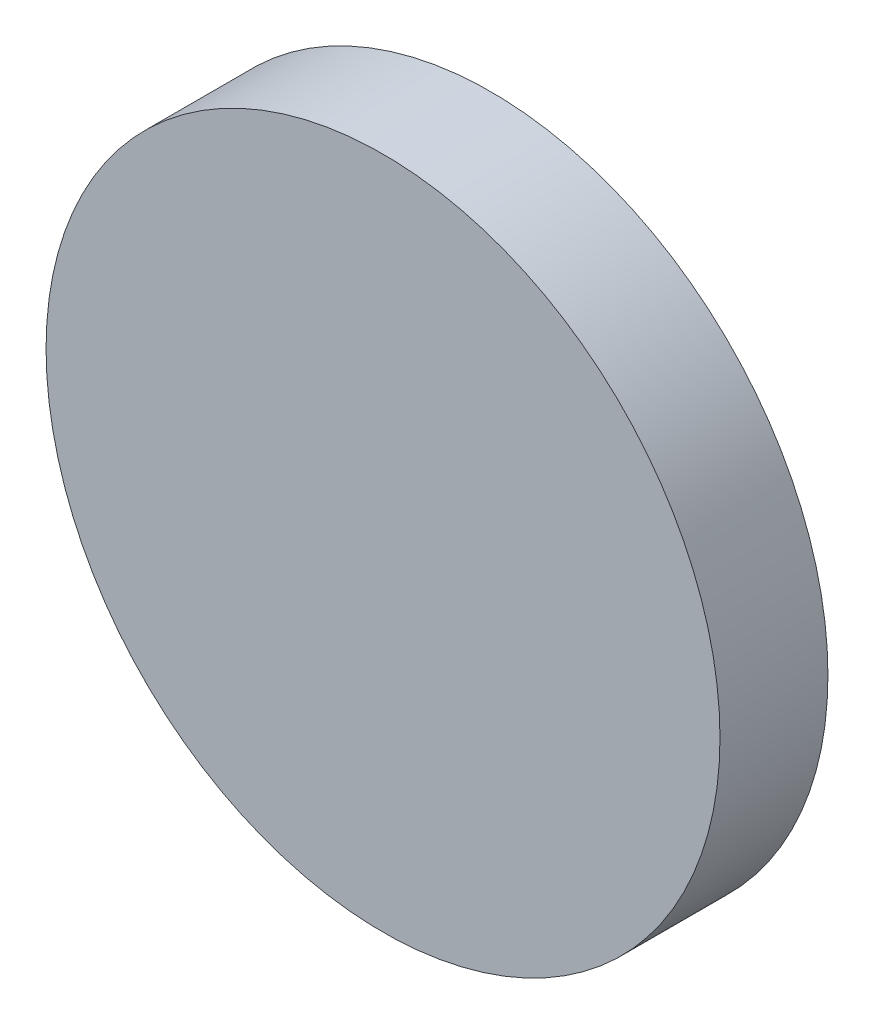
ISO-10303-21;
HEADER;
FILE_DESCRIPTION(('STEP AP214'),'2;1');
FILE_NAME('part.step','',(''),(''),'','','');
FILE_SCHEMA(('AUTOMOTIVE_DESIGN { 1 0 10303 214 1 1 1 1 }'));
ENDSEC;
DATA;
#1=APPLICATION_CONTEXT('core data for automotive mechanical design processes');
#2=APPLICATION_PROTOCOL_DEFINITION('international standard','automotive_design',2000,#1);
#3=PRODUCT_CONTEXT('',#1,'mechanical');
#4=PRODUCT('Part','Part','',(#3));
#5=PRODUCT_RELATED_PRODUCT_CATEGORY('part','',(#4));
#6=PRODUCT_DEFINITION_FORMATION('','',#4);
#7=PRODUCT_DEFINITION_CONTEXT('part definition',#1,'design');
#8=PRODUCT_DEFINITION('design','',#6,#7);
#9=PRODUCT_DEFINITION_SHAPE('','',#8);
#10=(LENGTH_UNIT() NAMED_UNIT(*) SI_UNIT(.MILLI.,.METRE.));
#11=(NAMED_UNIT(*) PLANE_ANGLE_UNIT() SI_UNIT($,.RADIAN.));
#12=(NAMED_UNIT(*) SI_UNIT($,.STERADIAN.) SOLID_ANGLE_UNIT());
#13=UNCERTAINTY_MEASURE_WITH_UNIT(LENGTH_MEASURE(1.E-05),#10,'distance_accuracy_value','');
#14=(GEOMETRIC_REPRESENTATION_CONTEXT(3) GLOBAL_UNCERTAINTY_ASSIGNED_CONTEXT((#13)) GLOBAL_UNIT_ASSIGNED_CONTEXT((#10,
#11,#12)) REPRESENTATION_CONTEXT('',''));
#15=CARTESIAN_POINT('',(0.,0.,0.));
#16=DIRECTION('',(0.,0.,1.));
#17=DIRECTION('',(1.,0.,0.));
#18=AXIS2_PLACEMENT_3D('',#15,#16,#17);
#19=CARTESIAN_POINT('',(0.,0.,10.));
#20=DIRECTION('',(0.,0.,-1.));
#21=DIRECTION('',(-1.,0.,0.));
#22=AXIS2_PLACEMENT_3D('',#19,#20,#21);
#23=CYLINDRICAL_SURFACE('',#22,31.2150434603476);
#24=CARTESIAN_POINT('',(0.,0.,10.));
#25=DIRECTION('',(0.,0.,1.));
#26=DIRECTION('',(1.,0.,0.));
#27=AXIS2_PLACEMENT_3D('',#24,#25,#26);
#28=CIRCLE('',#27,31.2150434603476);
#29=CARTESIAN_POINT('',(31.2150434603476,0.,10.));
#30=VERTEX_POINT('',#29);
#31=EDGE_CURVE('E10',#30,#30,#28,.T.);
#32=ORIENTED_EDGE('',*,*,#31,.F.);
#33=EDGE_LOOP('',(#32));
#34=FACE_BOUND('',#33,.T.);
#35=CARTESIAN_POINT('',(0.,0.,0.));
#36=DIRECTION('',(0.,0.,1.));
#37=DIRECTION('',(1.,0.,0.));
#38=AXIS2_PLACEMENT_3D('',#35,#36,#37);
#39=CIRCLE('',#38,31.2150434603476);
#40=CARTESIAN_POINT('',(31.2150434603476,0.,0.));
#41=VERTEX_POINT('',#40);
#42=EDGE_CURVE('E34',#41,#41,#39,.T.);
#43=ORIENTED_EDGE('',*,*,#42,.T.);
#44=EDGE_LOOP('',(#43));
#45=FACE_BOUND('',#44,.T.);
#46=ADVANCED_FACE('F31',(#34,#45),#23,.T.);
#47=CARTESIAN_POINT('',(0.,0.,10.));
#48=DIRECTION('',(0.,0.,1.));
#49=DIRECTION('',(1.,0.,0.));
#50=AXIS2_PLACEMENT_3D('',#47,#48,#49);
#51=PLANE('',#50);
#52=ORIENTED_EDGE('',*,*,#31,.T.);
#53=EDGE_LOOP('',(#52));
#54=FACE_BOUND('',#53,.T.);
#55=ADVANCED_FACE('F46',(#54),#51,.T.);
#56=CARTESIAN_POINT('',(0.,0.,0.));
#57=DIRECTION('',(0.,0.,1.));
#58=DIRECTION('',(1.,0.,0.));
#59=AXIS2_PLACEMENT_3D('',#56,#57,#58);
#60=PLANE('',#59);
#61=ORIENTED_EDGE('',*,*,#42,.F.);
#62=EDGE_LOOP('',(#61));
#63=FACE_BOUND('',#62,.T.);
#64=ADVANCED_FACE('F44',(#63),#60,.F.);
#65=CLOSED_SHELL('',(#46,#55,#64));
#66=MANIFOLD_SOLID_BREP('B2',#65);
#67=ADVANCED_BREP_SHAPE_REPRESENTATION('',(#18,#66),#14);
#68=SHAPE_DEFINITION_REPRESENTATION(#9,#67);
ENDSEC;
END-ISO-10303-21;
